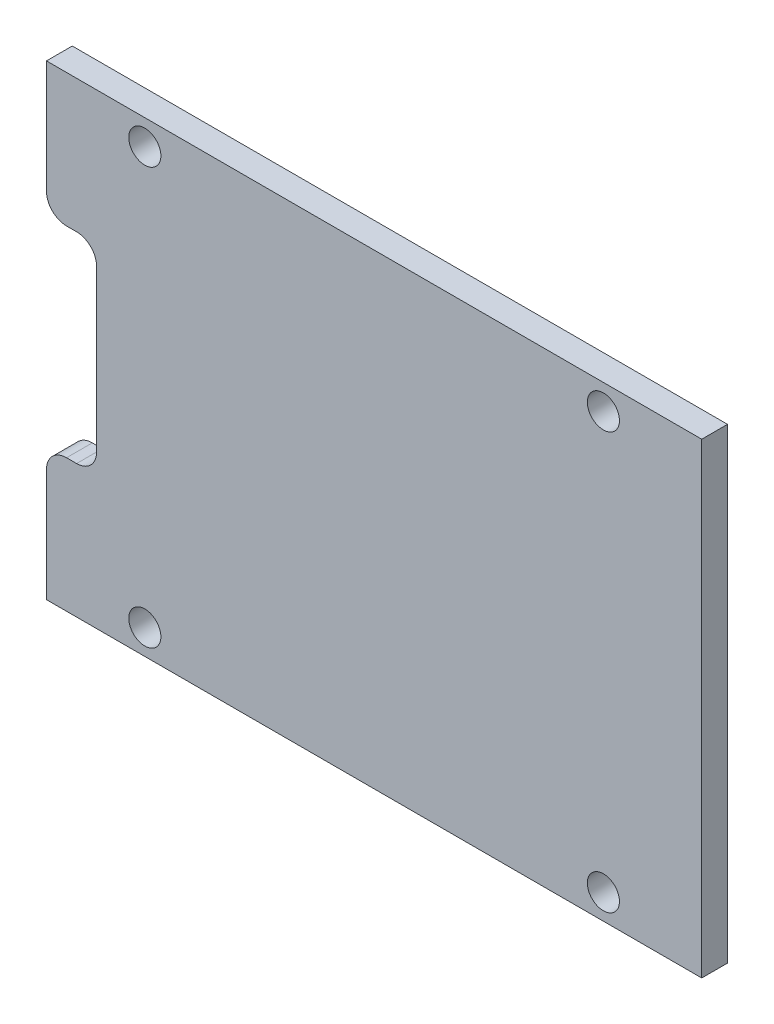
ISO-10303-21;
HEADER;
FILE_DESCRIPTION(('STEP AP214'),'2;1');
FILE_NAME('part.step','',(''),(''),'','','');
FILE_SCHEMA(('AUTOMOTIVE_DESIGN { 1 0 10303 214 1 1 1 1 }'));
ENDSEC;
DATA;
#1=APPLICATION_CONTEXT('core data for automotive mechanical design processes');
#2=APPLICATION_PROTOCOL_DEFINITION('international standard','automotive_design',2000,#1);
#3=PRODUCT_CONTEXT('',#1,'mechanical');
#4=PRODUCT('Part','Part','',(#3));
#5=PRODUCT_RELATED_PRODUCT_CATEGORY('part','',(#4));
#6=PRODUCT_DEFINITION_FORMATION('','',#4);
#7=PRODUCT_DEFINITION_CONTEXT('part definition',#1,'design');
#8=PRODUCT_DEFINITION('design','',#6,#7);
#9=PRODUCT_DEFINITION_SHAPE('','',#8);
#10=(LENGTH_UNIT() NAMED_UNIT(*) SI_UNIT(.MILLI.,.METRE.));
#11=(NAMED_UNIT(*) PLANE_ANGLE_UNIT() SI_UNIT($,.RADIAN.));
#12=(NAMED_UNIT(*) SI_UNIT($,.STERADIAN.) SOLID_ANGLE_UNIT());
#13=UNCERTAINTY_MEASURE_WITH_UNIT(LENGTH_MEASURE(1.E-05),#10,'distance_accuracy_value','');
#14=(GEOMETRIC_REPRESENTATION_CONTEXT(3) GLOBAL_UNCERTAINTY_ASSIGNED_CONTEXT((#13)) GLOBAL_UNIT_ASSIGNED_CONTEXT((#10,
#11,#12)) REPRESENTATION_CONTEXT('',''));
#15=CARTESIAN_POINT('',(0.,0.,0.));
#16=DIRECTION('',(0.,0.,1.));
#17=DIRECTION('',(1.,0.,0.));
#18=AXIS2_PLACEMENT_3D('',#15,#16,#17);
#19=CARTESIAN_POINT('',(-39.8000000000001,5.20000000000002,2.57));
#20=DIRECTION('',(1.,0.,0.));
#21=DIRECTION('',(0.,0.,-1.));
#22=AXIS2_PLACEMENT_3D('',#19,#20,#21);
#23=PLANE('',#22);
#24=DIRECTION('',(0.,-1.,0.));
#25=VECTOR('',#24,1.);
#26=CARTESIAN_POINT('',(-39.8000000000001,5.20000000000002,0.));
#27=LINE('',#26,#25);
#28=CARTESIAN_POINT('',(-39.8000000000001,5.20000000000002,0.));
#29=VERTEX_POINT('',#28);
#30=CARTESIAN_POINT('',(-39.8000000000001,-6.05,0.));
#31=VERTEX_POINT('',#30);
#32=EDGE_CURVE('E217',#29,#31,#27,.T.);
#33=ORIENTED_EDGE('',*,*,#32,.T.);
#34=DIRECTION('',(0.,0.,1.));
#35=VECTOR('',#34,1.);
#36=CARTESIAN_POINT('',(-39.8000000000001,-6.05,2.57));
#37=LINE('',#36,#35);
#38=CARTESIAN_POINT('',(-39.8000000000001,-6.05,2.57));
#39=VERTEX_POINT('',#38);
#40=EDGE_CURVE('E176',#31,#39,#37,.T.);
#41=ORIENTED_EDGE('',*,*,#40,.T.);
#42=DIRECTION('',(0.,-1.,0.));
#43=VECTOR('',#42,1.);
#44=CARTESIAN_POINT('',(-39.8000000000001,5.20000000000002,2.57));
#45=LINE('',#44,#43);
#46=CARTESIAN_POINT('',(-39.8000000000001,5.20000000000002,2.57));
#47=VERTEX_POINT('',#46);
#48=EDGE_CURVE('E216',#47,#39,#45,.T.);
#49=ORIENTED_EDGE('',*,*,#48,.F.);
#50=DIRECTION('',(0.,0.,-1.));
#51=VECTOR('',#50,1.);
#52=CARTESIAN_POINT('',(-39.8000000000001,5.20000000000002,2.57));
#53=LINE('',#52,#51);
#54=EDGE_CURVE('E131',#47,#29,#53,.T.);
#55=ORIENTED_EDGE('',*,*,#54,.T.);
#56=EDGE_LOOP('',(#33,#41,#49,#55));
#57=FACE_BOUND('',#56,.T.);
#58=ADVANCED_FACE('F33',(#57),#23,.F.);
#59=CARTESIAN_POINT('',(25.4999999999999,-41.3,2.57));
#60=DIRECTION('',(-1.,0.,0.));
#61=DIRECTION('',(0.,-1.,0.));
#62=AXIS2_PLACEMENT_3D('',#59,#60,#61);
#63=PLANE('',#62);
#64=DIRECTION('',(0.,1.,0.));
#65=VECTOR('',#64,1.);
#66=CARTESIAN_POINT('',(25.4999999999999,-41.3,0.));
#67=LINE('',#66,#65);
#68=CARTESIAN_POINT('',(25.4999999999999,-41.3,0.));
#69=VERTEX_POINT('',#68);
#70=CARTESIAN_POINT('',(25.4999999999999,5.20000000000002,0.));
#71=VERTEX_POINT('',#70);
#72=EDGE_CURVE('E151',#69,#71,#67,.T.);
#73=ORIENTED_EDGE('',*,*,#72,.T.);
#74=DIRECTION('',(0.,0.,-1.));
#75=VECTOR('',#74,1.);
#76=CARTESIAN_POINT('',(25.4999999999999,5.20000000000002,2.57));
#77=LINE('',#76,#75);
#78=CARTESIAN_POINT('',(25.4999999999999,5.20000000000002,2.57));
#79=VERTEX_POINT('',#78);
#80=EDGE_CURVE('E128',#79,#71,#77,.T.);
#81=ORIENTED_EDGE('',*,*,#80,.F.);
#82=DIRECTION('',(0.,1.,0.));
#83=VECTOR('',#82,1.);
#84=CARTESIAN_POINT('',(25.4999999999999,-41.3,2.57));
#85=LINE('',#84,#83);
#86=CARTESIAN_POINT('',(25.4999999999999,-41.3,2.57));
#87=VERTEX_POINT('',#86);
#88=EDGE_CURVE('E136',#87,#79,#85,.T.);
#89=ORIENTED_EDGE('',*,*,#88,.F.);
#90=DIRECTION('',(0.,0.,-1.));
#91=VECTOR('',#90,1.);
#92=CARTESIAN_POINT('',(25.4999999999999,-41.3,2.57));
#93=LINE('',#92,#91);
#94=EDGE_CURVE('E219',#87,#69,#93,.T.);
#95=ORIENTED_EDGE('',*,*,#94,.T.);
#96=EDGE_LOOP('',(#73,#81,#89,#95));
#97=FACE_BOUND('',#96,.T.);
#98=ADVANCED_FACE('F149',(#97),#63,.F.);
#99=CARTESIAN_POINT('',(25.4999999999999,5.20000000000002,2.57));
#100=DIRECTION('',(0.,-1.,0.));
#101=DIRECTION('',(0.,0.,-1.));
#102=AXIS2_PLACEMENT_3D('',#99,#100,#101);
#103=PLANE('',#102);
#104=DIRECTION('',(-1.,0.,0.));
#105=VECTOR('',#104,1.);
#106=CARTESIAN_POINT('',(25.4999999999999,5.20000000000002,0.));
#107=LINE('',#106,#105);
#108=EDGE_CURVE('E223',#71,#29,#107,.T.);
#109=ORIENTED_EDGE('',*,*,#108,.T.);
#110=ORIENTED_EDGE('',*,*,#54,.F.);
#111=DIRECTION('',(-1.,0.,0.));
#112=VECTOR('',#111,1.);
#113=CARTESIAN_POINT('',(25.4999999999999,5.20000000000002,2.57));
#114=LINE('',#113,#112);
#115=EDGE_CURVE('E124',#79,#47,#114,.T.);
#116=ORIENTED_EDGE('',*,*,#115,.F.);
#117=ORIENTED_EDGE('',*,*,#80,.T.);
#118=EDGE_LOOP('',(#109,#110,#116,#117));
#119=FACE_BOUND('',#118,.T.);
#120=ADVANCED_FACE('F126',(#119),#103,.F.);
#121=CARTESIAN_POINT('',(-39.8000000000001,-30.05,2.57));
#122=VERTEX_POINT('',#121);
#123=CARTESIAN_POINT('',(-39.8000000000001,-41.3,2.57));
#124=VERTEX_POINT('',#123);
#125=EDGE_CURVE('E135',#122,#124,#45,.T.);
#126=ORIENTED_EDGE('',*,*,#125,.F.);
#127=DIRECTION('',(0.,0.,1.));
#128=VECTOR('',#127,1.);
#129=CARTESIAN_POINT('',(-39.8000000000001,-30.05,2.57));
#130=LINE('',#129,#128);
#131=CARTESIAN_POINT('',(-39.8000000000001,-30.05,0.));
#132=VERTEX_POINT('',#131);
#133=EDGE_CURVE('E171',#122,#132,#130,.F.);
#134=ORIENTED_EDGE('',*,*,#133,.T.);
#135=CARTESIAN_POINT('',(-39.8000000000001,-41.3,0.));
#136=VERTEX_POINT('',#135);
#137=EDGE_CURVE('E226',#132,#136,#27,.T.);
#138=ORIENTED_EDGE('',*,*,#137,.T.);
#139=DIRECTION('',(0.,0.,-1.));
#140=VECTOR('',#139,1.);
#141=CARTESIAN_POINT('',(-39.8000000000001,-41.3,2.57));
#142=LINE('',#141,#140);
#143=EDGE_CURVE('E157',#124,#136,#142,.T.);
#144=ORIENTED_EDGE('',*,*,#143,.F.);
#145=EDGE_LOOP('',(#126,#134,#138,#144));
#146=FACE_BOUND('',#145,.T.);
#147=ADVANCED_FACE('F283',(#146),#23,.F.);
#148=CARTESIAN_POINT('',(-39.8000000000001,-41.3,2.57));
#149=DIRECTION('',(0.,1.,0.));
#150=DIRECTION('',(0.,0.,1.));
#151=AXIS2_PLACEMENT_3D('',#148,#149,#150);
#152=PLANE('',#151);
#153=DIRECTION('',(1.,0.,0.));
#154=VECTOR('',#153,1.);
#155=CARTESIAN_POINT('',(-39.8000000000001,-41.3,0.));
#156=LINE('',#155,#154);
#157=EDGE_CURVE('E147',#136,#69,#156,.T.);
#158=ORIENTED_EDGE('',*,*,#157,.T.);
#159=ORIENTED_EDGE('',*,*,#94,.F.);
#160=DIRECTION('',(1.,0.,0.));
#161=VECTOR('',#160,1.);
#162=CARTESIAN_POINT('',(-39.8000000000001,-41.3,2.57));
#163=LINE('',#162,#161);
#164=EDGE_CURVE('E143',#124,#87,#163,.T.);
#165=ORIENTED_EDGE('',*,*,#164,.F.);
#166=ORIENTED_EDGE('',*,*,#143,.T.);
#167=EDGE_LOOP('',(#158,#159,#165,#166));
#168=FACE_BOUND('',#167,.T.);
#169=ADVANCED_FACE('F233',(#168),#152,.F.);
#170=CARTESIAN_POINT('',(0.,0.,2.57));
#171=DIRECTION('',(0.,0.,1.));
#172=DIRECTION('',(1.,0.,0.));
#173=AXIS2_PLACEMENT_3D('',#170,#171,#172);
#174=PLANE('',#173);
#175=DIRECTION('',(1.,0.,0.));
#176=VECTOR('',#175,1.);
#177=CARTESIAN_POINT('',(-34.8000000000001,-28.05,2.57));
#178=LINE('',#177,#176);
#179=CARTESIAN_POINT('',(-37.8000000000001,-28.05,2.57));
#180=VERTEX_POINT('',#179);
#181=CARTESIAN_POINT('',(-36.8000000000001,-28.05,2.57));
#182=VERTEX_POINT('',#181);
#183=EDGE_CURVE('E204',#180,#182,#178,.T.);
#184=ORIENTED_EDGE('',*,*,#183,.F.);
#185=CARTESIAN_POINT('',(-37.8000000000001,-30.05,2.57));
#186=DIRECTION('',(0.,0.,1.));
#187=DIRECTION('',(1.,0.,0.));
#188=AXIS2_PLACEMENT_3D('',#185,#186,#187);
#189=CIRCLE('',#188,2.);
#190=EDGE_CURVE('E169',#180,#122,#189,.T.);
#191=ORIENTED_EDGE('',*,*,#190,.T.);
#192=ORIENTED_EDGE('',*,*,#125,.T.);
#193=ORIENTED_EDGE('',*,*,#164,.T.);
#194=ORIENTED_EDGE('',*,*,#88,.T.);
#195=ORIENTED_EDGE('',*,*,#115,.T.);
#196=ORIENTED_EDGE('',*,*,#48,.T.);
#197=CARTESIAN_POINT('',(-37.8000000000001,-6.05,2.57));
#198=DIRECTION('',(0.,0.,1.));
#199=DIRECTION('',(1.,0.,0.));
#200=AXIS2_PLACEMENT_3D('',#197,#198,#199);
#201=CIRCLE('',#200,2.);
#202=CARTESIAN_POINT('',(-37.8000000000001,-8.05,2.57));
#203=VERTEX_POINT('',#202);
#204=EDGE_CURVE('E167',#39,#203,#201,.T.);
#205=ORIENTED_EDGE('',*,*,#204,.T.);
#206=DIRECTION('',(-1.,0.,0.));
#207=VECTOR('',#206,1.);
#208=CARTESIAN_POINT('',(-34.8000000000001,-8.05,2.57));
#209=LINE('',#208,#207);
#210=CARTESIAN_POINT('',(-36.8000000000001,-8.05,2.57));
#211=VERTEX_POINT('',#210);
#212=EDGE_CURVE('E195',#211,#203,#209,.T.);
#213=ORIENTED_EDGE('',*,*,#212,.F.);
#214=CARTESIAN_POINT('',(-36.8000000000001,-10.05,2.57));
#215=DIRECTION('',(0.,0.,1.));
#216=DIRECTION('',(1.,0.,0.));
#217=AXIS2_PLACEMENT_3D('',#214,#215,#216);
#218=CIRCLE('',#217,2.);
#219=CARTESIAN_POINT('',(-34.8000000000001,-10.05,2.57));
#220=VERTEX_POINT('',#219);
#221=EDGE_CURVE('E41',#211,#220,#218,.F.);
#222=ORIENTED_EDGE('',*,*,#221,.T.);
#223=DIRECTION('',(0.,1.,0.));
#224=VECTOR('',#223,1.);
#225=CARTESIAN_POINT('',(-34.8000000000001,-8.05,2.57));
#226=LINE('',#225,#224);
#227=CARTESIAN_POINT('',(-34.8000000000001,-26.05,2.57));
#228=VERTEX_POINT('',#227);
#229=EDGE_CURVE('E194',#228,#220,#226,.T.);
#230=ORIENTED_EDGE('',*,*,#229,.F.);
#231=CARTESIAN_POINT('',(-36.8000000000001,-26.05,2.57));
#232=DIRECTION('',(0.,0.,1.));
#233=DIRECTION('',(1.,0.,0.));
#234=AXIS2_PLACEMENT_3D('',#231,#232,#233);
#235=CIRCLE('',#234,2.);
#236=EDGE_CURVE('E188',#228,#182,#235,.F.);
#237=ORIENTED_EDGE('',*,*,#236,.T.);
#238=EDGE_LOOP('',(#184,#191,#192,#193,#194,#195,#196,#205,#213,#222,#230,#237));
#239=FACE_BOUND('',#238,.T.);
#240=CARTESIAN_POINT('',(-30.0000000000001,-38.8,2.57));
#241=DIRECTION('',(0.,0.,1.));
#242=DIRECTION('',(1.,0.,0.));
#243=AXIS2_PLACEMENT_3D('',#240,#241,#242);
#244=CIRCLE('',#243,1.6);
#245=CARTESIAN_POINT('',(-28.4000000000001,-38.8,2.57));
#246=VERTEX_POINT('',#245);
#247=EDGE_CURVE('E249',#246,#246,#244,.T.);
#248=ORIENTED_EDGE('',*,*,#247,.F.);
#249=EDGE_LOOP('',(#248));
#250=FACE_BOUND('',#249,.T.);
#251=CARTESIAN_POINT('',(-30.0000000000001,2.70000000000004,2.57));
#252=DIRECTION('',(0.,0.,1.));
#253=DIRECTION('',(1.,0.,0.));
#254=AXIS2_PLACEMENT_3D('',#251,#252,#253);
#255=CIRCLE('',#254,1.6);
#256=CARTESIAN_POINT('',(-28.4000000000001,2.70000000000004,2.57));
#257=VERTEX_POINT('',#256);
#258=EDGE_CURVE('E260',#257,#257,#255,.T.);
#259=ORIENTED_EDGE('',*,*,#258,.F.);
#260=EDGE_LOOP('',(#259));
#261=FACE_BOUND('',#260,.T.);
#262=CARTESIAN_POINT('',(15.7,2.7,2.57));
#263=DIRECTION('',(0.,0.,1.));
#264=DIRECTION('',(1.,0.,0.));
#265=AXIS2_PLACEMENT_3D('',#262,#263,#264);
#266=CIRCLE('',#265,1.6);
#267=CARTESIAN_POINT('',(17.3,2.7,2.57));
#268=VERTEX_POINT('',#267);
#269=EDGE_CURVE('E254',#268,#268,#266,.T.);
#270=ORIENTED_EDGE('',*,*,#269,.F.);
#271=EDGE_LOOP('',(#270));
#272=FACE_BOUND('',#271,.T.);
#273=CARTESIAN_POINT('',(15.6999999999999,-38.8000000000001,2.57));
#274=DIRECTION('',(0.,0.,1.));
#275=DIRECTION('',(1.,0.,0.));
#276=AXIS2_PLACEMENT_3D('',#273,#274,#275);
#277=CIRCLE('',#276,1.6);
#278=CARTESIAN_POINT('',(17.2999999999999,-38.8000000000001,2.57));
#279=VERTEX_POINT('',#278);
#280=EDGE_CURVE('E253',#279,#279,#277,.T.);
#281=ORIENTED_EDGE('',*,*,#280,.F.);
#282=EDGE_LOOP('',(#281));
#283=FACE_BOUND('',#282,.T.);
#284=ADVANCED_FACE('F140',(#239,#250,#261,#272,#283),#174,.T.);
#285=CARTESIAN_POINT('',(0.,0.,0.));
#286=DIRECTION('',(0.,0.,1.));
#287=DIRECTION('',(1.,0.,0.));
#288=AXIS2_PLACEMENT_3D('',#285,#286,#287);
#289=PLANE('',#288);
#290=CARTESIAN_POINT('',(-30.0000000000001,-38.8,0.));
#291=DIRECTION('',(0.,0.,1.));
#292=DIRECTION('',(1.,0.,0.));
#293=AXIS2_PLACEMENT_3D('',#290,#291,#292);
#294=CIRCLE('',#293,1.6);
#295=CARTESIAN_POINT('',(-28.4000000000001,-38.8,0.));
#296=VERTEX_POINT('',#295);
#297=EDGE_CURVE('E263',#296,#296,#294,.T.);
#298=ORIENTED_EDGE('',*,*,#297,.T.);
#299=EDGE_LOOP('',(#298));
#300=FACE_BOUND('',#299,.T.);
#301=CARTESIAN_POINT('',(-30.0000000000001,2.70000000000004,0.));
#302=DIRECTION('',(0.,0.,1.));
#303=DIRECTION('',(1.,0.,0.));
#304=AXIS2_PLACEMENT_3D('',#301,#302,#303);
#305=CIRCLE('',#304,1.6);
#306=CARTESIAN_POINT('',(-28.4000000000001,2.70000000000004,0.));
#307=VERTEX_POINT('',#306);
#308=EDGE_CURVE('E257',#307,#307,#305,.T.);
#309=ORIENTED_EDGE('',*,*,#308,.T.);
#310=EDGE_LOOP('',(#309));
#311=FACE_BOUND('',#310,.T.);
#312=CARTESIAN_POINT('',(15.7,2.7,0.));
#313=DIRECTION('',(0.,0.,1.));
#314=DIRECTION('',(1.,0.,0.));
#315=AXIS2_PLACEMENT_3D('',#312,#313,#314);
#316=CIRCLE('',#315,1.6);
#317=CARTESIAN_POINT('',(17.3,2.7,0.));
#318=VERTEX_POINT('',#317);
#319=EDGE_CURVE('E250',#318,#318,#316,.T.);
#320=ORIENTED_EDGE('',*,*,#319,.T.);
#321=EDGE_LOOP('',(#320));
#322=FACE_BOUND('',#321,.T.);
#323=CARTESIAN_POINT('',(15.6999999999999,-38.8000000000001,0.));
#324=DIRECTION('',(0.,0.,1.));
#325=DIRECTION('',(1.,0.,0.));
#326=AXIS2_PLACEMENT_3D('',#323,#324,#325);
#327=CIRCLE('',#326,1.6);
#328=CARTESIAN_POINT('',(17.2999999999999,-38.8000000000001,0.));
#329=VERTEX_POINT('',#328);
#330=EDGE_CURVE('E224',#329,#329,#327,.T.);
#331=ORIENTED_EDGE('',*,*,#330,.T.);
#332=EDGE_LOOP('',(#331));
#333=FACE_BOUND('',#332,.T.);
#334=ORIENTED_EDGE('',*,*,#137,.F.);
#335=CARTESIAN_POINT('',(-37.8000000000001,-30.05,0.));
#336=DIRECTION('',(0.,0.,1.));
#337=DIRECTION('',(1.,0.,0.));
#338=AXIS2_PLACEMENT_3D('',#335,#336,#337);
#339=CIRCLE('',#338,2.);
#340=CARTESIAN_POINT('',(-37.8000000000001,-28.05,0.));
#341=VERTEX_POINT('',#340);
#342=EDGE_CURVE('E174',#132,#341,#339,.F.);
#343=ORIENTED_EDGE('',*,*,#342,.T.);
#344=DIRECTION('',(1.,0.,0.));
#345=VECTOR('',#344,1.);
#346=CARTESIAN_POINT('',(0.,-28.05,0.));
#347=LINE('',#346,#345);
#348=CARTESIAN_POINT('',(-36.8000000000001,-28.05,0.));
#349=VERTEX_POINT('',#348);
#350=EDGE_CURVE('E152',#341,#349,#347,.T.);
#351=ORIENTED_EDGE('',*,*,#350,.T.);
#352=CARTESIAN_POINT('',(-36.8000000000001,-26.05,0.));
#353=DIRECTION('',(0.,0.,1.));
#354=DIRECTION('',(1.,0.,0.));
#355=AXIS2_PLACEMENT_3D('',#352,#353,#354);
#356=CIRCLE('',#355,2.);
#357=CARTESIAN_POINT('',(-34.8000000000001,-26.05,0.));
#358=VERTEX_POINT('',#357);
#359=EDGE_CURVE('E190',#349,#358,#356,.T.);
#360=ORIENTED_EDGE('',*,*,#359,.T.);
#361=DIRECTION('',(0.,1.,0.));
#362=VECTOR('',#361,1.);
#363=CARTESIAN_POINT('',(-34.8000000000001,0.,0.));
#364=LINE('',#363,#362);
#365=CARTESIAN_POINT('',(-34.8000000000001,-10.05,0.));
#366=VERTEX_POINT('',#365);
#367=EDGE_CURVE('E209',#358,#366,#364,.T.);
#368=ORIENTED_EDGE('',*,*,#367,.T.);
#369=CARTESIAN_POINT('',(-36.8000000000001,-10.05,0.));
#370=DIRECTION('',(0.,0.,1.));
#371=DIRECTION('',(1.,0.,0.));
#372=AXIS2_PLACEMENT_3D('',#369,#370,#371);
#373=CIRCLE('',#372,2.);
#374=CARTESIAN_POINT('',(-36.8000000000001,-8.05,0.));
#375=VERTEX_POINT('',#374);
#376=EDGE_CURVE('E11',#366,#375,#373,.T.);
#377=ORIENTED_EDGE('',*,*,#376,.T.);
#378=DIRECTION('',(-1.,0.,0.));
#379=VECTOR('',#378,1.);
#380=CARTESIAN_POINT('',(0.,-8.04999999999999,0.));
#381=LINE('',#380,#379);
#382=CARTESIAN_POINT('',(-37.8000000000001,-8.05,0.));
#383=VERTEX_POINT('',#382);
#384=EDGE_CURVE('E155',#375,#383,#381,.T.);
#385=ORIENTED_EDGE('',*,*,#384,.T.);
#386=CARTESIAN_POINT('',(-37.8000000000001,-6.05,0.));
#387=DIRECTION('',(0.,0.,1.));
#388=DIRECTION('',(1.,0.,0.));
#389=AXIS2_PLACEMENT_3D('',#386,#387,#388);
#390=CIRCLE('',#389,2.);
#391=EDGE_CURVE('E48',#383,#31,#390,.F.);
#392=ORIENTED_EDGE('',*,*,#391,.T.);
#393=ORIENTED_EDGE('',*,*,#32,.F.);
#394=ORIENTED_EDGE('',*,*,#108,.F.);
#395=ORIENTED_EDGE('',*,*,#72,.F.);
#396=ORIENTED_EDGE('',*,*,#157,.F.);
#397=EDGE_LOOP('',(#334,#343,#351,#360,#368,#377,#385,#392,#393,#394,#395,#396));
#398=FACE_BOUND('',#397,.T.);
#399=ADVANCED_FACE('F208',(#300,#311,#322,#333,#398),#289,.F.);
#400=CARTESIAN_POINT('',(15.6999999999999,-38.8000000000001,0.));
#401=DIRECTION('',(0.,0.,1.));
#402=DIRECTION('',(1.,0.,0.));
#403=AXIS2_PLACEMENT_3D('',#400,#401,#402);
#404=CYLINDRICAL_SURFACE('',#403,1.6);
#405=ORIENTED_EDGE('',*,*,#330,.F.);
#406=EDGE_LOOP('',(#405));
#407=FACE_BOUND('',#406,.T.);
#408=ORIENTED_EDGE('',*,*,#280,.T.);
#409=EDGE_LOOP('',(#408));
#410=FACE_BOUND('',#409,.T.);
#411=ADVANCED_FACE('F273',(#407,#410),#404,.F.);
#412=CARTESIAN_POINT('',(15.7,2.7,0.));
#413=DIRECTION('',(0.,0.,1.));
#414=DIRECTION('',(1.,0.,0.));
#415=AXIS2_PLACEMENT_3D('',#412,#413,#414);
#416=CYLINDRICAL_SURFACE('',#415,1.6);
#417=ORIENTED_EDGE('',*,*,#319,.F.);
#418=EDGE_LOOP('',(#417));
#419=FACE_BOUND('',#418,.T.);
#420=ORIENTED_EDGE('',*,*,#269,.T.);
#421=EDGE_LOOP('',(#420));
#422=FACE_BOUND('',#421,.T.);
#423=ADVANCED_FACE('F394',(#419,#422),#416,.F.);
#424=CARTESIAN_POINT('',(-30.0000000000001,2.70000000000004,0.));
#425=DIRECTION('',(0.,0.,1.));
#426=DIRECTION('',(1.,0.,0.));
#427=AXIS2_PLACEMENT_3D('',#424,#425,#426);
#428=CYLINDRICAL_SURFACE('',#427,1.6);
#429=ORIENTED_EDGE('',*,*,#308,.F.);
#430=EDGE_LOOP('',(#429));
#431=FACE_BOUND('',#430,.T.);
#432=ORIENTED_EDGE('',*,*,#258,.T.);
#433=EDGE_LOOP('',(#432));
#434=FACE_BOUND('',#433,.T.);
#435=ADVANCED_FACE('F384',(#431,#434),#428,.F.);
#436=CARTESIAN_POINT('',(-30.0000000000001,-38.8,0.));
#437=DIRECTION('',(0.,0.,1.));
#438=DIRECTION('',(1.,0.,0.));
#439=AXIS2_PLACEMENT_3D('',#436,#437,#438);
#440=CYLINDRICAL_SURFACE('',#439,1.6);
#441=ORIENTED_EDGE('',*,*,#297,.F.);
#442=EDGE_LOOP('',(#441));
#443=FACE_BOUND('',#442,.T.);
#444=ORIENTED_EDGE('',*,*,#247,.T.);
#445=EDGE_LOOP('',(#444));
#446=FACE_BOUND('',#445,.T.);
#447=ADVANCED_FACE('F353',(#443,#446),#440,.F.);
#448=CARTESIAN_POINT('',(-34.8000000000001,-8.05,-7.43));
#449=DIRECTION('',(0.,1.,0.));
#450=DIRECTION('',(-1.,0.,0.));
#451=AXIS2_PLACEMENT_3D('',#448,#449,#450);
#452=PLANE('',#451);
#453=ORIENTED_EDGE('',*,*,#212,.T.);
#454=DIRECTION('',(0.,0.,1.));
#455=VECTOR('',#454,1.);
#456=CARTESIAN_POINT('',(-37.8000000000001,-8.05,-7.43));
#457=LINE('',#456,#455);
#458=EDGE_CURVE('E56',#203,#383,#457,.F.);
#459=ORIENTED_EDGE('',*,*,#458,.T.);
#460=ORIENTED_EDGE('',*,*,#384,.F.);
#461=DIRECTION('',(0.,0.,1.));
#462=VECTOR('',#461,1.);
#463=CARTESIAN_POINT('',(-36.8000000000001,-8.05,2.57));
#464=LINE('',#463,#462);
#465=EDGE_CURVE('E179',#375,#211,#464,.T.);
#466=ORIENTED_EDGE('',*,*,#465,.T.);
#467=EDGE_LOOP('',(#453,#459,#460,#466));
#468=FACE_BOUND('',#467,.T.);
#469=ADVANCED_FACE('F210',(#468),#452,.F.);
#470=CARTESIAN_POINT('',(-34.8000000000001,-28.05,-7.43));
#471=DIRECTION('',(0.,-1.,0.));
#472=DIRECTION('',(0.,0.,-1.));
#473=AXIS2_PLACEMENT_3D('',#470,#471,#472);
#474=PLANE('',#473);
#475=ORIENTED_EDGE('',*,*,#350,.F.);
#476=DIRECTION('',(0.,0.,1.));
#477=VECTOR('',#476,1.);
#478=CARTESIAN_POINT('',(-37.8000000000001,-28.05,-7.43));
#479=LINE('',#478,#477);
#480=EDGE_CURVE('E164',#341,#180,#479,.T.);
#481=ORIENTED_EDGE('',*,*,#480,.T.);
#482=ORIENTED_EDGE('',*,*,#183,.T.);
#483=DIRECTION('',(0.,0.,1.));
#484=VECTOR('',#483,1.);
#485=CARTESIAN_POINT('',(-36.8000000000001,-28.05,0.));
#486=LINE('',#485,#484);
#487=EDGE_CURVE('E162',#182,#349,#486,.F.);
#488=ORIENTED_EDGE('',*,*,#487,.T.);
#489=EDGE_LOOP('',(#475,#481,#482,#488));
#490=FACE_BOUND('',#489,.T.);
#491=ADVANCED_FACE('F244',(#490),#474,.F.);
#492=CARTESIAN_POINT('',(-34.8000000000001,-8.05,-7.43));
#493=DIRECTION('',(1.,0.,0.));
#494=DIRECTION('',(0.,0.,-1.));
#495=AXIS2_PLACEMENT_3D('',#492,#493,#494);
#496=PLANE('',#495);
#497=ORIENTED_EDGE('',*,*,#367,.F.);
#498=DIRECTION('',(0.,0.,1.));
#499=VECTOR('',#498,1.);
#500=CARTESIAN_POINT('',(-34.8000000000001,-26.05,2.57));
#501=LINE('',#500,#499);
#502=EDGE_CURVE('E185',#358,#228,#501,.T.);
#503=ORIENTED_EDGE('',*,*,#502,.T.);
#504=ORIENTED_EDGE('',*,*,#229,.T.);
#505=DIRECTION('',(0.,0.,1.));
#506=VECTOR('',#505,1.);
#507=CARTESIAN_POINT('',(-34.8000000000001,-10.05,0.));
#508=LINE('',#507,#506);
#509=EDGE_CURVE('E183',#220,#366,#508,.F.);
#510=ORIENTED_EDGE('',*,*,#509,.T.);
#511=EDGE_LOOP('',(#497,#503,#504,#510));
#512=FACE_BOUND('',#511,.T.);
#513=ADVANCED_FACE('F201',(#512),#496,.F.);
#514=CARTESIAN_POINT('',(-37.8000000000001,-30.05,-7.43));
#515=DIRECTION('',(0.,0.,1.));
#516=DIRECTION('',(1.,0.,0.));
#517=AXIS2_PLACEMENT_3D('',#514,#515,#516);
#518=CYLINDRICAL_SURFACE('',#517,2.);
#519=ORIENTED_EDGE('',*,*,#342,.F.);
#520=ORIENTED_EDGE('',*,*,#133,.F.);
#521=ORIENTED_EDGE('',*,*,#190,.F.);
#522=ORIENTED_EDGE('',*,*,#480,.F.);
#523=EDGE_LOOP('',(#519,#520,#521,#522));
#524=FACE_BOUND('',#523,.T.);
#525=ADVANCED_FACE('F241',(#524),#518,.T.);
#526=CARTESIAN_POINT('',(-37.8000000000001,-6.05,2.57));
#527=DIRECTION('',(0.,0.,1.));
#528=DIRECTION('',(1.,0.,0.));
#529=AXIS2_PLACEMENT_3D('',#526,#527,#528);
#530=CYLINDRICAL_SURFACE('',#529,2.);
#531=ORIENTED_EDGE('',*,*,#391,.F.);
#532=ORIENTED_EDGE('',*,*,#458,.F.);
#533=ORIENTED_EDGE('',*,*,#204,.F.);
#534=ORIENTED_EDGE('',*,*,#40,.F.);
#535=EDGE_LOOP('',(#531,#532,#533,#534));
#536=FACE_BOUND('',#535,.T.);
#537=ADVANCED_FACE('F213',(#536),#530,.T.);
#538=CARTESIAN_POINT('',(-36.8000000000001,-26.05,-7.43));
#539=DIRECTION('',(0.,0.,-1.));
#540=DIRECTION('',(-1.,0.,0.));
#541=AXIS2_PLACEMENT_3D('',#538,#539,#540);
#542=CYLINDRICAL_SURFACE('',#541,2.);
#543=ORIENTED_EDGE('',*,*,#359,.F.);
#544=ORIENTED_EDGE('',*,*,#487,.F.);
#545=ORIENTED_EDGE('',*,*,#236,.F.);
#546=ORIENTED_EDGE('',*,*,#502,.F.);
#547=EDGE_LOOP('',(#543,#544,#545,#546));
#548=FACE_BOUND('',#547,.T.);
#549=ADVANCED_FACE('F303',(#548),#542,.F.);
#550=CARTESIAN_POINT('',(-36.8000000000001,-10.05,-7.43));
#551=DIRECTION('',(0.,0.,-1.));
#552=DIRECTION('',(-1.,0.,0.));
#553=AXIS2_PLACEMENT_3D('',#550,#551,#552);
#554=CYLINDRICAL_SURFACE('',#553,2.);
#555=ORIENTED_EDGE('',*,*,#376,.F.);
#556=ORIENTED_EDGE('',*,*,#509,.F.);
#557=ORIENTED_EDGE('',*,*,#221,.F.);
#558=ORIENTED_EDGE('',*,*,#465,.F.);
#559=EDGE_LOOP('',(#555,#556,#557,#558));
#560=FACE_BOUND('',#559,.T.);
#561=ADVANCED_FACE('F35',(#560),#554,.F.);
#562=CLOSED_SHELL('',(#58,#98,#120,#147,#169,#284,#399,#411,#423,#435,#447,#469,#491,#513,#525,
#537,#549,#561));
#563=MANIFOLD_SOLID_BREP('B2',#562);
#564=ADVANCED_BREP_SHAPE_REPRESENTATION('',(#18,#563),#14);
#565=SHAPE_DEFINITION_REPRESENTATION(#9,#564);
ENDSEC;
END-ISO-10303-21;
